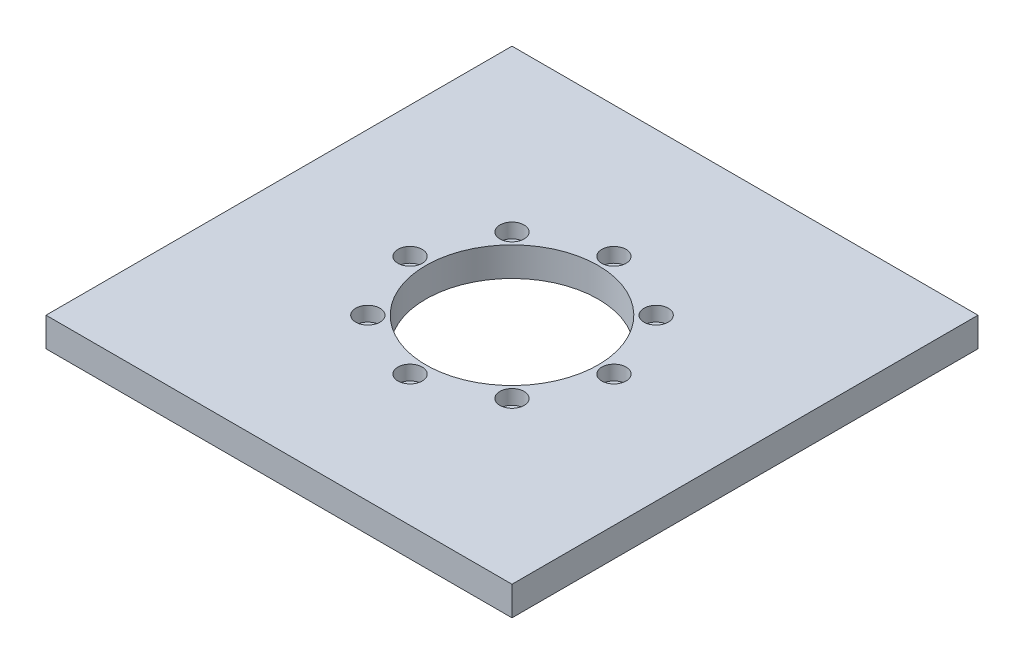
ISO-10303-21;
HEADER;
FILE_DESCRIPTION(('STEP AP214'),'2;1');
FILE_NAME('part.step','',(''),(''),'','','');
FILE_SCHEMA(('AUTOMOTIVE_DESIGN { 1 0 10303 214 1 1 1 1 }'));
ENDSEC;
DATA;
#1=APPLICATION_CONTEXT('core data for automotive mechanical design processes');
#2=APPLICATION_PROTOCOL_DEFINITION('international standard','automotive_design',2000,#1);
#3=PRODUCT_CONTEXT('',#1,'mechanical');
#4=PRODUCT('Part','Part','',(#3));
#5=PRODUCT_RELATED_PRODUCT_CATEGORY('part','',(#4));
#6=PRODUCT_DEFINITION_FORMATION('','',#4);
#7=PRODUCT_DEFINITION_CONTEXT('part definition',#1,'design');
#8=PRODUCT_DEFINITION('design','',#6,#7);
#9=PRODUCT_DEFINITION_SHAPE('','',#8);
#10=(LENGTH_UNIT() NAMED_UNIT(*) SI_UNIT(.MILLI.,.METRE.));
#11=(NAMED_UNIT(*) PLANE_ANGLE_UNIT() SI_UNIT($,.RADIAN.));
#12=(NAMED_UNIT(*) SI_UNIT($,.STERADIAN.) SOLID_ANGLE_UNIT());
#13=UNCERTAINTY_MEASURE_WITH_UNIT(LENGTH_MEASURE(1.E-05),#10,'distance_accuracy_value','');
#14=(GEOMETRIC_REPRESENTATION_CONTEXT(3) GLOBAL_UNCERTAINTY_ASSIGNED_CONTEXT((#13)) GLOBAL_UNIT_ASSIGNED_CONTEXT((#10,
#11,#12)) REPRESENTATION_CONTEXT('',''));
#15=CARTESIAN_POINT('',(0.,0.,0.));
#16=DIRECTION('',(0.,0.,1.));
#17=DIRECTION('',(1.,0.,0.));
#18=AXIS2_PLACEMENT_3D('',#15,#16,#17);
#19=CARTESIAN_POINT('',(0.,19.05,0.));
#20=DIRECTION('',(0.,1.,0.));
#21=DIRECTION('',(0.,0.,1.));
#22=AXIS2_PLACEMENT_3D('',#19,#20,#21);
#23=PLANE('',#22);
#24=CARTESIAN_POINT('',(66.675,19.05,-7.68489198065737E-13));
#25=DIRECTION('',(0.,1.,0.));
#26=DIRECTION('',(0.,0.,1.));
#27=AXIS2_PLACEMENT_3D('',#24,#25,#26);
#28=CIRCLE('',#27,7.9375);
#29=CARTESIAN_POINT('',(66.675,19.05,7.93749999999923));
#30=VERTEX_POINT('',#29);
#31=EDGE_CURVE('E210',#30,#30,#28,.T.);
#32=ORIENTED_EDGE('',*,*,#31,.F.);
#33=EDGE_LOOP('',(#32));
#34=FACE_BOUND('',#33,.T.);
#35=CARTESIAN_POINT('',(47.1463446356131,19.05,-47.1463446356131));
#36=DIRECTION('',(0.,1.,0.));
#37=DIRECTION('',(0.,0.,1.));
#38=AXIS2_PLACEMENT_3D('',#35,#36,#37);
#39=CIRCLE('',#38,7.9375);
#40=CARTESIAN_POINT('',(47.1463446356131,19.05,-39.2088446356131));
#41=VERTEX_POINT('',#40);
#42=EDGE_CURVE('E198',#41,#41,#39,.T.);
#43=ORIENTED_EDGE('',*,*,#42,.F.);
#44=EDGE_LOOP('',(#43));
#45=FACE_BOUND('',#44,.T.);
#46=CARTESIAN_POINT('',(0.,19.05,-66.675));
#47=DIRECTION('',(0.,1.,0.));
#48=DIRECTION('',(0.,0.,1.));
#49=AXIS2_PLACEMENT_3D('',#46,#47,#48);
#50=CIRCLE('',#49,7.9375);
#51=CARTESIAN_POINT('',(0.,19.05,-58.7375));
#52=VERTEX_POINT('',#51);
#53=EDGE_CURVE('E186',#52,#52,#50,.T.);
#54=ORIENTED_EDGE('',*,*,#53,.F.);
#55=EDGE_LOOP('',(#54));
#56=FACE_BOUND('',#55,.T.);
#57=CARTESIAN_POINT('',(-47.146344635613,19.05,-47.1463446356131));
#58=DIRECTION('',(0.,1.,0.));
#59=DIRECTION('',(0.,0.,1.));
#60=AXIS2_PLACEMENT_3D('',#57,#58,#59);
#61=CIRCLE('',#60,7.9375);
#62=CARTESIAN_POINT('',(-47.146344635613,19.05,-39.2088446356131));
#63=VERTEX_POINT('',#62);
#64=EDGE_CURVE('E174',#63,#63,#61,.T.);
#65=ORIENTED_EDGE('',*,*,#64,.F.);
#66=EDGE_LOOP('',(#65));
#67=FACE_BOUND('',#66,.T.);
#68=CARTESIAN_POINT('',(-66.675,19.05,0.));
#69=DIRECTION('',(0.,1.,0.));
#70=DIRECTION('',(0.,0.,1.));
#71=AXIS2_PLACEMENT_3D('',#68,#69,#70);
#72=CIRCLE('',#71,7.9375);
#73=CARTESIAN_POINT('',(-66.675,19.05,7.9375));
#74=VERTEX_POINT('',#73);
#75=EDGE_CURVE('E162',#74,#74,#72,.T.);
#76=ORIENTED_EDGE('',*,*,#75,.F.);
#77=EDGE_LOOP('',(#76));
#78=FACE_BOUND('',#77,.T.);
#79=CARTESIAN_POINT('',(-47.1463446356131,19.05,47.146344635613));
#80=DIRECTION('',(0.,1.,0.));
#81=DIRECTION('',(0.,0.,1.));
#82=AXIS2_PLACEMENT_3D('',#79,#80,#81);
#83=CIRCLE('',#82,7.9375);
#84=CARTESIAN_POINT('',(-47.1463446356131,19.05,55.083844635613));
#85=VERTEX_POINT('',#84);
#86=EDGE_CURVE('E150',#85,#85,#83,.T.);
#87=ORIENTED_EDGE('',*,*,#86,.F.);
#88=EDGE_LOOP('',(#87));
#89=FACE_BOUND('',#88,.T.);
#90=CARTESIAN_POINT('',(0.,19.05,66.675));
#91=DIRECTION('',(0.,1.,0.));
#92=DIRECTION('',(0.,0.,1.));
#93=AXIS2_PLACEMENT_3D('',#90,#91,#92);
#94=CIRCLE('',#93,7.9375);
#95=CARTESIAN_POINT('',(0.,19.05,74.6125));
#96=VERTEX_POINT('',#95);
#97=EDGE_CURVE('E138',#96,#96,#94,.T.);
#98=ORIENTED_EDGE('',*,*,#97,.F.);
#99=EDGE_LOOP('',(#98));
#100=FACE_BOUND('',#99,.T.);
#101=CARTESIAN_POINT('',(47.146344635613,19.05,47.1463446356131));
#102=DIRECTION('',(0.,1.,0.));
#103=DIRECTION('',(0.,0.,1.));
#104=AXIS2_PLACEMENT_3D('',#101,#102,#103);
#105=CIRCLE('',#104,7.9375);
#106=CARTESIAN_POINT('',(47.146344635613,19.05,55.0838446356131));
#107=VERTEX_POINT('',#106);
#108=EDGE_CURVE('E126',#107,#107,#105,.T.);
#109=ORIENTED_EDGE('',*,*,#108,.F.);
#110=EDGE_LOOP('',(#109));
#111=FACE_BOUND('',#110,.T.);
#112=DIRECTION('',(0.,0.,1.));
#113=VECTOR('',#112,1.);
#114=CARTESIAN_POINT('',(-152.4,19.05,152.4));
#115=LINE('',#114,#113);
#116=CARTESIAN_POINT('',(-152.4,19.05,-152.4));
#117=VERTEX_POINT('',#116);
#118=CARTESIAN_POINT('',(-152.4,19.05,152.4));
#119=VERTEX_POINT('',#118);
#120=EDGE_CURVE('E85',#117,#119,#115,.T.);
#121=ORIENTED_EDGE('',*,*,#120,.T.);
#122=DIRECTION('',(1.,0.,0.));
#123=VECTOR('',#122,1.);
#124=CARTESIAN_POINT('',(152.4,19.05,152.4));
#125=LINE('',#124,#123);
#126=CARTESIAN_POINT('',(152.4,19.05,152.4));
#127=VERTEX_POINT('',#126);
#128=EDGE_CURVE('E80',#119,#127,#125,.T.);
#129=ORIENTED_EDGE('',*,*,#128,.T.);
#130=DIRECTION('',(0.,0.,-1.));
#131=VECTOR('',#130,1.);
#132=CARTESIAN_POINT('',(152.4,19.05,152.4));
#133=LINE('',#132,#131);
#134=CARTESIAN_POINT('',(152.4,19.05,-152.4));
#135=VERTEX_POINT('',#134);
#136=EDGE_CURVE('E83',#127,#135,#133,.T.);
#137=ORIENTED_EDGE('',*,*,#136,.T.);
#138=DIRECTION('',(-1.,0.,0.));
#139=VECTOR('',#138,1.);
#140=CARTESIAN_POINT('',(152.4,19.05,-152.4));
#141=LINE('',#140,#139);
#142=EDGE_CURVE('E50',#135,#117,#141,.T.);
#143=ORIENTED_EDGE('',*,*,#142,.T.);
#144=EDGE_LOOP('',(#121,#129,#137,#143));
#145=FACE_BOUND('',#144,.T.);
#146=CARTESIAN_POINT('',(0.,19.05,0.));
#147=DIRECTION('',(0.,1.,0.));
#148=DIRECTION('',(0.,0.,1.));
#149=AXIS2_PLACEMENT_3D('',#146,#147,#148);
#150=CIRCLE('',#149,56.35625);
#151=CARTESIAN_POINT('',(0.,19.05,-56.35625));
#152=VERTEX_POINT('',#151);
#153=EDGE_CURVE('E100',#152,#152,#150,.T.);
#154=ORIENTED_EDGE('',*,*,#153,.F.);
#155=EDGE_LOOP('',(#154));
#156=FACE_BOUND('',#155,.T.);
#157=ADVANCED_FACE('F33',(#34,#45,#56,#67,#78,#89,#100,#111,#145,#156),#23,.T.);
#158=CARTESIAN_POINT('',(0.,0.,0.));
#159=DIRECTION('',(0.,1.,0.));
#160=DIRECTION('',(0.,0.,1.));
#161=AXIS2_PLACEMENT_3D('',#158,#159,#160);
#162=PLANE('',#161);
#163=CARTESIAN_POINT('',(66.675,0.,-7.68489198065737E-13));
#164=DIRECTION('',(0.,1.,0.));
#165=DIRECTION('',(0.,0.,1.));
#166=AXIS2_PLACEMENT_3D('',#163,#164,#165);
#167=CIRCLE('',#166,4.90220000000001);
#168=CARTESIAN_POINT('',(66.675,0.,4.90219999999924));
#169=VERTEX_POINT('',#168);
#170=EDGE_CURVE('E201',#169,#169,#167,.T.);
#171=ORIENTED_EDGE('',*,*,#170,.T.);
#172=EDGE_LOOP('',(#171));
#173=FACE_BOUND('',#172,.T.);
#174=CARTESIAN_POINT('',(47.1463446356131,0.,-47.1463446356131));
#175=DIRECTION('',(0.,1.,0.));
#176=DIRECTION('',(0.,0.,1.));
#177=AXIS2_PLACEMENT_3D('',#174,#175,#176);
#178=CIRCLE('',#177,4.9022);
#179=CARTESIAN_POINT('',(47.1463446356131,0.,-42.2441446356131));
#180=VERTEX_POINT('',#179);
#181=EDGE_CURVE('E189',#180,#180,#178,.T.);
#182=ORIENTED_EDGE('',*,*,#181,.T.);
#183=EDGE_LOOP('',(#182));
#184=FACE_BOUND('',#183,.T.);
#185=CARTESIAN_POINT('',(0.,0.,-66.675));
#186=DIRECTION('',(0.,1.,0.));
#187=DIRECTION('',(0.,0.,1.));
#188=AXIS2_PLACEMENT_3D('',#185,#186,#187);
#189=CIRCLE('',#188,4.90220000000001);
#190=CARTESIAN_POINT('',(0.,0.,-61.7728));
#191=VERTEX_POINT('',#190);
#192=EDGE_CURVE('E177',#191,#191,#189,.T.);
#193=ORIENTED_EDGE('',*,*,#192,.T.);
#194=EDGE_LOOP('',(#193));
#195=FACE_BOUND('',#194,.T.);
#196=CARTESIAN_POINT('',(-47.146344635613,0.,-47.1463446356131));
#197=DIRECTION('',(0.,1.,0.));
#198=DIRECTION('',(0.,0.,1.));
#199=AXIS2_PLACEMENT_3D('',#196,#197,#198);
#200=CIRCLE('',#199,4.9022);
#201=CARTESIAN_POINT('',(-47.146344635613,0.,-42.2441446356131));
#202=VERTEX_POINT('',#201);
#203=EDGE_CURVE('E165',#202,#202,#200,.T.);
#204=ORIENTED_EDGE('',*,*,#203,.T.);
#205=EDGE_LOOP('',(#204));
#206=FACE_BOUND('',#205,.T.);
#207=CARTESIAN_POINT('',(-66.675,0.,0.));
#208=DIRECTION('',(0.,1.,0.));
#209=DIRECTION('',(0.,0.,1.));
#210=AXIS2_PLACEMENT_3D('',#207,#208,#209);
#211=CIRCLE('',#210,4.90220000000001);
#212=CARTESIAN_POINT('',(-66.675,0.,4.90220000000001));
#213=VERTEX_POINT('',#212);
#214=EDGE_CURVE('E153',#213,#213,#211,.T.);
#215=ORIENTED_EDGE('',*,*,#214,.T.);
#216=EDGE_LOOP('',(#215));
#217=FACE_BOUND('',#216,.T.);
#218=CARTESIAN_POINT('',(-47.1463446356131,0.,47.146344635613));
#219=DIRECTION('',(0.,1.,0.));
#220=DIRECTION('',(0.,0.,1.));
#221=AXIS2_PLACEMENT_3D('',#218,#219,#220);
#222=CIRCLE('',#221,4.90220000000001);
#223=CARTESIAN_POINT('',(-47.1463446356131,0.,52.0485446356131));
#224=VERTEX_POINT('',#223);
#225=EDGE_CURVE('E141',#224,#224,#222,.T.);
#226=ORIENTED_EDGE('',*,*,#225,.T.);
#227=EDGE_LOOP('',(#226));
#228=FACE_BOUND('',#227,.T.);
#229=CARTESIAN_POINT('',(0.,0.,66.675));
#230=DIRECTION('',(0.,1.,0.));
#231=DIRECTION('',(0.,0.,1.));
#232=AXIS2_PLACEMENT_3D('',#229,#230,#231);
#233=CIRCLE('',#232,4.90220000000001);
#234=CARTESIAN_POINT('',(0.,0.,71.5772));
#235=VERTEX_POINT('',#234);
#236=EDGE_CURVE('E129',#235,#235,#233,.T.);
#237=ORIENTED_EDGE('',*,*,#236,.T.);
#238=EDGE_LOOP('',(#237));
#239=FACE_BOUND('',#238,.T.);
#240=CARTESIAN_POINT('',(47.146344635613,0.,47.1463446356131));
#241=DIRECTION('',(0.,1.,0.));
#242=DIRECTION('',(0.,0.,1.));
#243=AXIS2_PLACEMENT_3D('',#240,#241,#242);
#244=CIRCLE('',#243,4.9022);
#245=CARTESIAN_POINT('',(47.146344635613,0.,52.0485446356131));
#246=VERTEX_POINT('',#245);
#247=EDGE_CURVE('E115',#246,#246,#244,.T.);
#248=ORIENTED_EDGE('',*,*,#247,.T.);
#249=EDGE_LOOP('',(#248));
#250=FACE_BOUND('',#249,.T.);
#251=DIRECTION('',(0.,0.,1.));
#252=VECTOR('',#251,1.);
#253=CARTESIAN_POINT('',(-152.4,0.,152.4));
#254=LINE('',#253,#252);
#255=CARTESIAN_POINT('',(-152.4,0.,-152.4));
#256=VERTEX_POINT('',#255);
#257=CARTESIAN_POINT('',(-152.4,0.,152.4));
#258=VERTEX_POINT('',#257);
#259=EDGE_CURVE('E97',#256,#258,#254,.T.);
#260=ORIENTED_EDGE('',*,*,#259,.F.);
#261=DIRECTION('',(-1.,0.,0.));
#262=VECTOR('',#261,1.);
#263=CARTESIAN_POINT('',(152.4,0.,-152.4));
#264=LINE('',#263,#262);
#265=CARTESIAN_POINT('',(152.4,0.,-152.4));
#266=VERTEX_POINT('',#265);
#267=EDGE_CURVE('E73',#266,#256,#264,.T.);
#268=ORIENTED_EDGE('',*,*,#267,.F.);
#269=DIRECTION('',(0.,0.,-1.));
#270=VECTOR('',#269,1.);
#271=CARTESIAN_POINT('',(152.4,0.,152.4));
#272=LINE('',#271,#270);
#273=CARTESIAN_POINT('',(152.4,0.,152.4));
#274=VERTEX_POINT('',#273);
#275=EDGE_CURVE('E67',#274,#266,#272,.T.);
#276=ORIENTED_EDGE('',*,*,#275,.F.);
#277=DIRECTION('',(1.,0.,0.));
#278=VECTOR('',#277,1.);
#279=CARTESIAN_POINT('',(152.4,0.,152.4));
#280=LINE('',#279,#278);
#281=EDGE_CURVE('E89',#258,#274,#280,.T.);
#282=ORIENTED_EDGE('',*,*,#281,.F.);
#283=EDGE_LOOP('',(#260,#268,#276,#282));
#284=FACE_BOUND('',#283,.T.);
#285=CARTESIAN_POINT('',(0.,0.,0.));
#286=DIRECTION('',(0.,1.,0.));
#287=DIRECTION('',(0.,0.,1.));
#288=AXIS2_PLACEMENT_3D('',#285,#286,#287);
#289=CIRCLE('',#288,56.35625);
#290=CARTESIAN_POINT('',(0.,0.,-56.35625));
#291=VERTEX_POINT('',#290);
#292=EDGE_CURVE('E112',#291,#291,#289,.T.);
#293=ORIENTED_EDGE('',*,*,#292,.T.);
#294=EDGE_LOOP('',(#293));
#295=FACE_BOUND('',#294,.T.);
#296=ADVANCED_FACE('F108',(#173,#184,#195,#206,#217,#228,#239,#250,#284,#295),#162,.F.);
#297=CARTESIAN_POINT('',(-152.4,19.05,152.4));
#298=DIRECTION('',(1.,0.,0.));
#299=DIRECTION('',(0.,0.,-1.));
#300=AXIS2_PLACEMENT_3D('',#297,#298,#299);
#301=PLANE('',#300);
#302=ORIENTED_EDGE('',*,*,#259,.T.);
#303=DIRECTION('',(0.,-1.,0.));
#304=VECTOR('',#303,1.);
#305=CARTESIAN_POINT('',(-152.4,19.05,152.4));
#306=LINE('',#305,#304);
#307=EDGE_CURVE('E11',#119,#258,#306,.T.);
#308=ORIENTED_EDGE('',*,*,#307,.F.);
#309=ORIENTED_EDGE('',*,*,#120,.F.);
#310=DIRECTION('',(0.,-1.,0.));
#311=VECTOR('',#310,1.);
#312=CARTESIAN_POINT('',(-152.4,19.05,-152.4));
#313=LINE('',#312,#311);
#314=EDGE_CURVE('E93',#117,#256,#313,.T.);
#315=ORIENTED_EDGE('',*,*,#314,.T.);
#316=EDGE_LOOP('',(#302,#308,#309,#315));
#317=FACE_BOUND('',#316,.T.);
#318=ADVANCED_FACE('F35',(#317),#301,.F.);
#319=CARTESIAN_POINT('',(152.4,19.05,152.4));
#320=DIRECTION('',(0.,0.,-1.));
#321=DIRECTION('',(-1.,0.,0.));
#322=AXIS2_PLACEMENT_3D('',#319,#320,#321);
#323=PLANE('',#322);
#324=ORIENTED_EDGE('',*,*,#281,.T.);
#325=DIRECTION('',(0.,-1.,0.));
#326=VECTOR('',#325,1.);
#327=CARTESIAN_POINT('',(152.4,19.05,152.4));
#328=LINE('',#327,#326);
#329=EDGE_CURVE('E42',#127,#274,#328,.T.);
#330=ORIENTED_EDGE('',*,*,#329,.F.);
#331=ORIENTED_EDGE('',*,*,#128,.F.);
#332=ORIENTED_EDGE('',*,*,#307,.T.);
#333=EDGE_LOOP('',(#324,#330,#331,#332));
#334=FACE_BOUND('',#333,.T.);
#335=ADVANCED_FACE('F88',(#334),#323,.F.);
#336=CARTESIAN_POINT('',(152.4,19.05,152.4));
#337=DIRECTION('',(-1.,0.,0.));
#338=DIRECTION('',(0.,0.,1.));
#339=AXIS2_PLACEMENT_3D('',#336,#337,#338);
#340=PLANE('',#339);
#341=ORIENTED_EDGE('',*,*,#275,.T.);
#342=DIRECTION('',(0.,-1.,0.));
#343=VECTOR('',#342,1.);
#344=CARTESIAN_POINT('',(152.4,19.05,-152.4));
#345=LINE('',#344,#343);
#346=EDGE_CURVE('E90',#135,#266,#345,.T.);
#347=ORIENTED_EDGE('',*,*,#346,.F.);
#348=ORIENTED_EDGE('',*,*,#136,.F.);
#349=ORIENTED_EDGE('',*,*,#329,.T.);
#350=EDGE_LOOP('',(#341,#347,#348,#349));
#351=FACE_BOUND('',#350,.T.);
#352=ADVANCED_FACE('F91',(#351),#340,.F.);
#353=CARTESIAN_POINT('',(152.4,19.05,-152.4));
#354=DIRECTION('',(0.,0.,1.));
#355=DIRECTION('',(1.,0.,0.));
#356=AXIS2_PLACEMENT_3D('',#353,#354,#355);
#357=PLANE('',#356);
#358=ORIENTED_EDGE('',*,*,#267,.T.);
#359=ORIENTED_EDGE('',*,*,#314,.F.);
#360=ORIENTED_EDGE('',*,*,#142,.F.);
#361=ORIENTED_EDGE('',*,*,#346,.T.);
#362=EDGE_LOOP('',(#358,#359,#360,#361));
#363=FACE_BOUND('',#362,.T.);
#364=ADVANCED_FACE('F105',(#363),#357,.F.);
#365=CARTESIAN_POINT('',(0.,19.05,0.));
#366=DIRECTION('',(0.,-1.,0.));
#367=DIRECTION('',(0.,0.,-1.));
#368=AXIS2_PLACEMENT_3D('',#365,#366,#367);
#369=CYLINDRICAL_SURFACE('',#368,56.35625);
#370=CARTESIAN_POINT('',(0.,19.05,-56.35625));
#371=CARTESIAN_POINT('',(0.,18.8515625,-56.35625));
#372=CARTESIAN_POINT('',(0.,18.653125,-56.35625));
#373=CARTESIAN_POINT('',(0.,18.25625,-56.35625));
#374=CARTESIAN_POINT('',(0.,18.0578125,-56.35625));
#375=CARTESIAN_POINT('',(0.,17.6609375,-56.35625));
#376=CARTESIAN_POINT('',(0.,17.4625,-56.35625));
#377=CARTESIAN_POINT('',(0.,17.065625,-56.35625));
#378=CARTESIAN_POINT('',(0.,16.8671875,-56.35625));
#379=CARTESIAN_POINT('',(0.,16.4703125,-56.35625));
#380=CARTESIAN_POINT('',(0.,16.271875,-56.35625));
#381=CARTESIAN_POINT('',(0.,15.875,-56.35625));
#382=CARTESIAN_POINT('',(0.,15.6765625,-56.35625));
#383=CARTESIAN_POINT('',(0.,15.2796875,-56.35625));
#384=CARTESIAN_POINT('',(0.,15.08125,-56.35625));
#385=CARTESIAN_POINT('',(0.,14.684375,-56.35625));
#386=CARTESIAN_POINT('',(0.,14.4859375,-56.35625));
#387=CARTESIAN_POINT('',(0.,14.0890625,-56.35625));
#388=CARTESIAN_POINT('',(0.,13.890625,-56.35625));
#389=CARTESIAN_POINT('',(0.,13.49375,-56.35625));
#390=CARTESIAN_POINT('',(0.,13.2953125,-56.35625));
#391=CARTESIAN_POINT('',(0.,12.8984375,-56.35625));
#392=CARTESIAN_POINT('',(0.,12.7,-56.35625));
#393=CARTESIAN_POINT('',(0.,12.303125,-56.35625));
#394=CARTESIAN_POINT('',(0.,12.1046875,-56.35625));
#395=CARTESIAN_POINT('',(0.,11.7078125,-56.35625));
#396=CARTESIAN_POINT('',(0.,11.509375,-56.35625));
#397=CARTESIAN_POINT('',(0.,11.1125,-56.35625));
#398=CARTESIAN_POINT('',(0.,10.9140625,-56.35625));
#399=CARTESIAN_POINT('',(0.,10.5171875,-56.35625));
#400=CARTESIAN_POINT('',(0.,10.31875,-56.35625));
#401=CARTESIAN_POINT('',(0.,9.921875,-56.35625));
#402=CARTESIAN_POINT('',(0.,9.7234375,-56.35625));
#403=CARTESIAN_POINT('',(0.,9.3265625,-56.35625));
#404=CARTESIAN_POINT('',(0.,9.128125,-56.35625));
#405=CARTESIAN_POINT('',(0.,8.73125,-56.35625));
#406=CARTESIAN_POINT('',(0.,8.5328125,-56.35625));
#407=CARTESIAN_POINT('',(0.,8.1359375,-56.35625));
#408=CARTESIAN_POINT('',(0.,7.9375,-56.35625));
#409=CARTESIAN_POINT('',(0.,7.540625,-56.35625));
#410=CARTESIAN_POINT('',(0.,7.3421875,-56.35625));
#411=CARTESIAN_POINT('',(0.,6.9453125,-56.35625));
#412=CARTESIAN_POINT('',(0.,6.746875,-56.35625));
#413=CARTESIAN_POINT('',(0.,6.35,-56.35625));
#414=CARTESIAN_POINT('',(0.,6.1515625,-56.35625));
#415=CARTESIAN_POINT('',(0.,5.7546875,-56.35625));
#416=CARTESIAN_POINT('',(0.,5.55625,-56.35625));
#417=CARTESIAN_POINT('',(0.,5.159375,-56.35625));
#418=CARTESIAN_POINT('',(0.,4.9609375,-56.35625));
#419=CARTESIAN_POINT('',(0.,4.5640625,-56.35625));
#420=CARTESIAN_POINT('',(0.,4.365625,-56.35625));
#421=CARTESIAN_POINT('',(0.,3.96875,-56.35625));
#422=CARTESIAN_POINT('',(0.,3.7703125,-56.35625));
#423=CARTESIAN_POINT('',(0.,3.3734375,-56.35625));
#424=CARTESIAN_POINT('',(0.,3.175,-56.35625));
#425=CARTESIAN_POINT('',(0.,2.778125,-56.35625));
#426=CARTESIAN_POINT('',(0.,2.5796875,-56.35625));
#427=CARTESIAN_POINT('',(0.,2.1828125,-56.35625));
#428=CARTESIAN_POINT('',(0.,1.984375,-56.35625));
#429=CARTESIAN_POINT('',(0.,1.5875,-56.35625));
#430=CARTESIAN_POINT('',(0.,1.3890625,-56.35625));
#431=CARTESIAN_POINT('',(0.,0.992187500000001,-56.35625));
#432=CARTESIAN_POINT('',(0.,0.793750000000001,-56.35625));
#433=CARTESIAN_POINT('',(0.,0.396875,-56.35625));
#434=CARTESIAN_POINT('',(0.,0.1984375,-56.35625));
#435=CARTESIAN_POINT('',(0.,0.,-56.35625));
#436=B_SPLINE_CURVE_WITH_KNOTS('',3,(#370,#371,#372,#373,#374,#375,#376,#377,#378,#379,#380,
#381,#382,#383,#384,#385,#386,#387,#388,#389,#390,#391,#392,#393,#394,#395,#396,#397,#398,#399,
#400,#401,#402,#403,#404,#405,#406,#407,#408,#409,#410,#411,#412,#413,#414,#415,#416,#417,#418,
#419,#420,#421,#422,#423,#424,#425,#426,#427,#428,#429,#430,#431,#432,#433,#434,#435),
.UNSPECIFIED.,.F.,.F.,(4,2,2,2,2,2,2,2,2,2,2,2,2,2,2,2,2,2,2,2,2,2,2,2,2,2,2,2,2,2,2,2,4),(0.,
0.5953125,1.190625,1.7859375,2.38125,2.9765625,3.571875,4.1671875,4.7625,5.3578125,5.953125,
6.5484375,7.14375,7.7390625,8.334375,8.9296875,9.525,10.1203125,10.715625,11.3109375,11.90625,
12.5015625,13.096875,13.6921875,14.2875,14.8828125,15.478125,16.0734375,16.66875,17.2640625,
17.859375,18.4546875,19.05),.UNSPECIFIED.);
#437=EDGE_CURVE('BSEAM254',#152,#291,#436,.T.);
#438=ORIENTED_EDGE('',*,*,#153,.T.);
#439=ORIENTED_EDGE('',*,*,#292,.F.);
#440=ORIENTED_EDGE('',*,*,#437,.T.);
#441=ORIENTED_EDGE('',*,*,#437,.F.);
#442=EDGE_LOOP('',(#438,#440,#439,#441));
#443=FACE_BOUND('',#442,.T.);
#444=ADVANCED_FACE('F254',(#443),#369,.F.);
#445=CARTESIAN_POINT('',(47.146344635613,19.05,47.1463446356131));
#446=DIRECTION('',(0.,1.,0.));
#447=DIRECTION('',(0.,0.,1.));
#448=AXIS2_PLACEMENT_3D('',#445,#446,#447);
#449=CYLINDRICAL_SURFACE('',#448,4.9022);
#450=ORIENTED_EDGE('',*,*,#247,.F.);
#451=EDGE_LOOP('',(#450));
#452=FACE_BOUND('',#451,.T.);
#453=CARTESIAN_POINT('',(47.146344635613,9.525,47.1463446356131));
#454=DIRECTION('',(0.,1.,0.));
#455=DIRECTION('',(0.,0.,1.));
#456=AXIS2_PLACEMENT_3D('',#453,#454,#455);
#457=CIRCLE('',#456,4.9022);
#458=CARTESIAN_POINT('',(47.146344635613,9.525,52.0485446356131));
#459=VERTEX_POINT('',#458);
#460=EDGE_CURVE('E120',#459,#459,#457,.T.);
#461=ORIENTED_EDGE('',*,*,#460,.T.);
#462=EDGE_LOOP('',(#461));
#463=FACE_BOUND('',#462,.T.);
#464=ADVANCED_FACE('F246',(#452,#463),#449,.F.);
#465=CARTESIAN_POINT('',(52.048544635613,9.525,47.1463446356131));
#466=DIRECTION('',(0.,-1.,0.));
#467=DIRECTION('',(0.,0.,-1.));
#468=AXIS2_PLACEMENT_3D('',#465,#466,#467);
#469=PLANE('',#468);
#470=ORIENTED_EDGE('',*,*,#460,.F.);
#471=EDGE_LOOP('',(#470));
#472=FACE_BOUND('',#471,.T.);
#473=CARTESIAN_POINT('',(47.146344635613,9.525,47.1463446356131));
#474=DIRECTION('',(0.,1.,0.));
#475=DIRECTION('',(0.,0.,1.));
#476=AXIS2_PLACEMENT_3D('',#473,#474,#475);
#477=CIRCLE('',#476,7.9375);
#478=CARTESIAN_POINT('',(47.146344635613,9.525,55.0838446356131));
#479=VERTEX_POINT('',#478);
#480=EDGE_CURVE('E123',#479,#479,#477,.T.);
#481=ORIENTED_EDGE('',*,*,#480,.T.);
#482=EDGE_LOOP('',(#481));
#483=FACE_BOUND('',#482,.T.);
#484=ADVANCED_FACE('F236',(#472,#483),#469,.F.);
#485=CARTESIAN_POINT('',(47.146344635613,19.05,47.1463446356131));
#486=DIRECTION('',(0.,1.,0.));
#487=DIRECTION('',(0.,0.,1.));
#488=AXIS2_PLACEMENT_3D('',#485,#486,#487);
#489=CYLINDRICAL_SURFACE('',#488,7.9375);
#490=ORIENTED_EDGE('',*,*,#480,.F.);
#491=EDGE_LOOP('',(#490));
#492=FACE_BOUND('',#491,.T.);
#493=ORIENTED_EDGE('',*,*,#108,.T.);
#494=EDGE_LOOP('',(#493));
#495=FACE_BOUND('',#494,.T.);
#496=ADVANCED_FACE('F233',(#492,#495),#489,.F.);
#497=CARTESIAN_POINT('',(0.,19.05,66.675));
#498=DIRECTION('',(0.,1.,0.));
#499=DIRECTION('',(0.,0.,1.));
#500=AXIS2_PLACEMENT_3D('',#497,#498,#499);
#501=CYLINDRICAL_SURFACE('',#500,4.9022);
#502=ORIENTED_EDGE('',*,*,#236,.F.);
#503=EDGE_LOOP('',(#502));
#504=FACE_BOUND('',#503,.T.);
#505=CARTESIAN_POINT('',(0.,9.525,66.675));
#506=DIRECTION('',(0.,1.,0.));
#507=DIRECTION('',(0.,0.,1.));
#508=AXIS2_PLACEMENT_3D('',#505,#506,#507);
#509=CIRCLE('',#508,4.9022);
#510=CARTESIAN_POINT('',(0.,9.525,71.5772));
#511=VERTEX_POINT('',#510);
#512=EDGE_CURVE('E132',#511,#511,#509,.T.);
#513=ORIENTED_EDGE('',*,*,#512,.T.);
#514=EDGE_LOOP('',(#513));
#515=FACE_BOUND('',#514,.T.);
#516=ADVANCED_FACE('F235',(#504,#515),#501,.F.);
#517=CARTESIAN_POINT('',(4.90220000000003,9.525,66.675));
#518=DIRECTION('',(0.,-1.,0.));
#519=DIRECTION('',(0.,0.,-1.));
#520=AXIS2_PLACEMENT_3D('',#517,#518,#519);
#521=PLANE('',#520);
#522=ORIENTED_EDGE('',*,*,#512,.F.);
#523=EDGE_LOOP('',(#522));
#524=FACE_BOUND('',#523,.T.);
#525=CARTESIAN_POINT('',(0.,9.525,66.675));
#526=DIRECTION('',(0.,1.,0.));
#527=DIRECTION('',(0.,0.,1.));
#528=AXIS2_PLACEMENT_3D('',#525,#526,#527);
#529=CIRCLE('',#528,7.9375);
#530=CARTESIAN_POINT('',(0.,9.525,74.6125));
#531=VERTEX_POINT('',#530);
#532=EDGE_CURVE('E135',#531,#531,#529,.T.);
#533=ORIENTED_EDGE('',*,*,#532,.T.);
#534=EDGE_LOOP('',(#533));
#535=FACE_BOUND('',#534,.T.);
#536=ADVANCED_FACE('F243',(#524,#535),#521,.F.);
#537=CARTESIAN_POINT('',(0.,19.05,66.675));
#538=DIRECTION('',(0.,1.,0.));
#539=DIRECTION('',(0.,0.,1.));
#540=AXIS2_PLACEMENT_3D('',#537,#538,#539);
#541=CYLINDRICAL_SURFACE('',#540,7.9375);
#542=ORIENTED_EDGE('',*,*,#532,.F.);
#543=EDGE_LOOP('',(#542));
#544=FACE_BOUND('',#543,.T.);
#545=ORIENTED_EDGE('',*,*,#97,.T.);
#546=EDGE_LOOP('',(#545));
#547=FACE_BOUND('',#546,.T.);
#548=ADVANCED_FACE('F334',(#544,#547),#541,.F.);
#549=CARTESIAN_POINT('',(-47.1463446356131,19.05,47.146344635613));
#550=DIRECTION('',(0.,1.,0.));
#551=DIRECTION('',(0.,0.,1.));
#552=AXIS2_PLACEMENT_3D('',#549,#550,#551);
#553=CYLINDRICAL_SURFACE('',#552,4.9022);
#554=ORIENTED_EDGE('',*,*,#225,.F.);
#555=EDGE_LOOP('',(#554));
#556=FACE_BOUND('',#555,.T.);
#557=CARTESIAN_POINT('',(-47.1463446356131,9.525,47.146344635613));
#558=DIRECTION('',(0.,1.,0.));
#559=DIRECTION('',(0.,0.,1.));
#560=AXIS2_PLACEMENT_3D('',#557,#558,#559);
#561=CIRCLE('',#560,4.9022);
#562=CARTESIAN_POINT('',(-47.1463446356131,9.525,52.048544635613));
#563=VERTEX_POINT('',#562);
#564=EDGE_CURVE('E144',#563,#563,#561,.T.);
#565=ORIENTED_EDGE('',*,*,#564,.T.);
#566=EDGE_LOOP('',(#565));
#567=FACE_BOUND('',#566,.T.);
#568=ADVANCED_FACE('F343',(#556,#567),#553,.F.);
#569=CARTESIAN_POINT('',(-42.2441446356131,9.525,47.146344635613));
#570=DIRECTION('',(0.,-1.,0.));
#571=DIRECTION('',(0.,0.,-1.));
#572=AXIS2_PLACEMENT_3D('',#569,#570,#571);
#573=PLANE('',#572);
#574=ORIENTED_EDGE('',*,*,#564,.F.);
#575=EDGE_LOOP('',(#574));
#576=FACE_BOUND('',#575,.T.);
#577=CARTESIAN_POINT('',(-47.1463446356131,9.525,47.146344635613));
#578=DIRECTION('',(0.,1.,0.));
#579=DIRECTION('',(0.,0.,1.));
#580=AXIS2_PLACEMENT_3D('',#577,#578,#579);
#581=CIRCLE('',#580,7.9375);
#582=CARTESIAN_POINT('',(-47.1463446356131,9.525,55.083844635613));
#583=VERTEX_POINT('',#582);
#584=EDGE_CURVE('E147',#583,#583,#581,.T.);
#585=ORIENTED_EDGE('',*,*,#584,.T.);
#586=EDGE_LOOP('',(#585));
#587=FACE_BOUND('',#586,.T.);
#588=ADVANCED_FACE('F353',(#576,#587),#573,.F.);
#589=CARTESIAN_POINT('',(-47.1463446356131,19.05,47.146344635613));
#590=DIRECTION('',(0.,1.,0.));
#591=DIRECTION('',(0.,0.,1.));
#592=AXIS2_PLACEMENT_3D('',#589,#590,#591);
#593=CYLINDRICAL_SURFACE('',#592,7.9375);
#594=ORIENTED_EDGE('',*,*,#584,.F.);
#595=EDGE_LOOP('',(#594));
#596=FACE_BOUND('',#595,.T.);
#597=ORIENTED_EDGE('',*,*,#86,.T.);
#598=EDGE_LOOP('',(#597));
#599=FACE_BOUND('',#598,.T.);
#600=ADVANCED_FACE('F363',(#596,#599),#593,.F.);
#601=CARTESIAN_POINT('',(-66.675,19.05,0.));
#602=DIRECTION('',(0.,1.,0.));
#603=DIRECTION('',(0.,0.,1.));
#604=AXIS2_PLACEMENT_3D('',#601,#602,#603);
#605=CYLINDRICAL_SURFACE('',#604,4.9022);
#606=ORIENTED_EDGE('',*,*,#214,.F.);
#607=EDGE_LOOP('',(#606));
#608=FACE_BOUND('',#607,.T.);
#609=CARTESIAN_POINT('',(-66.675,9.525,0.));
#610=DIRECTION('',(0.,1.,0.));
#611=DIRECTION('',(0.,0.,1.));
#612=AXIS2_PLACEMENT_3D('',#609,#610,#611);
#613=CIRCLE('',#612,4.9022);
#614=CARTESIAN_POINT('',(-66.675,9.525,4.9022));
#615=VERTEX_POINT('',#614);
#616=EDGE_CURVE('E156',#615,#615,#613,.T.);
#617=ORIENTED_EDGE('',*,*,#616,.T.);
#618=EDGE_LOOP('',(#617));
#619=FACE_BOUND('',#618,.T.);
#620=ADVANCED_FACE('F373',(#608,#619),#605,.F.);
#621=CARTESIAN_POINT('',(-61.7728,9.525,0.));
#622=DIRECTION('',(0.,-1.,0.));
#623=DIRECTION('',(0.,0.,-1.));
#624=AXIS2_PLACEMENT_3D('',#621,#622,#623);
#625=PLANE('',#624);
#626=ORIENTED_EDGE('',*,*,#616,.F.);
#627=EDGE_LOOP('',(#626));
#628=FACE_BOUND('',#627,.T.);
#629=CARTESIAN_POINT('',(-66.675,9.525,0.));
#630=DIRECTION('',(0.,1.,0.));
#631=DIRECTION('',(0.,0.,1.));
#632=AXIS2_PLACEMENT_3D('',#629,#630,#631);
#633=CIRCLE('',#632,7.9375);
#634=CARTESIAN_POINT('',(-66.675,9.525,7.9375));
#635=VERTEX_POINT('',#634);
#636=EDGE_CURVE('E159',#635,#635,#633,.T.);
#637=ORIENTED_EDGE('',*,*,#636,.T.);
#638=EDGE_LOOP('',(#637));
#639=FACE_BOUND('',#638,.T.);
#640=ADVANCED_FACE('F383',(#628,#639),#625,.F.);
#641=CARTESIAN_POINT('',(-66.675,19.05,0.));
#642=DIRECTION('',(0.,1.,0.));
#643=DIRECTION('',(0.,0.,1.));
#644=AXIS2_PLACEMENT_3D('',#641,#642,#643);
#645=CYLINDRICAL_SURFACE('',#644,7.9375);
#646=ORIENTED_EDGE('',*,*,#636,.F.);
#647=EDGE_LOOP('',(#646));
#648=FACE_BOUND('',#647,.T.);
#649=ORIENTED_EDGE('',*,*,#75,.T.);
#650=EDGE_LOOP('',(#649));
#651=FACE_BOUND('',#650,.T.);
#652=ADVANCED_FACE('F393',(#648,#651),#645,.F.);
#653=CARTESIAN_POINT('',(-47.146344635613,19.05,-47.1463446356131));
#654=DIRECTION('',(0.,1.,0.));
#655=DIRECTION('',(0.,0.,1.));
#656=AXIS2_PLACEMENT_3D('',#653,#654,#655);
#657=CYLINDRICAL_SURFACE('',#656,4.9022);
#658=ORIENTED_EDGE('',*,*,#203,.F.);
#659=EDGE_LOOP('',(#658));
#660=FACE_BOUND('',#659,.T.);
#661=CARTESIAN_POINT('',(-47.146344635613,9.525,-47.1463446356131));
#662=DIRECTION('',(0.,1.,0.));
#663=DIRECTION('',(0.,0.,1.));
#664=AXIS2_PLACEMENT_3D('',#661,#662,#663);
#665=CIRCLE('',#664,4.9022);
#666=CARTESIAN_POINT('',(-47.146344635613,9.525,-42.2441446356131));
#667=VERTEX_POINT('',#666);
#668=EDGE_CURVE('E168',#667,#667,#665,.T.);
#669=ORIENTED_EDGE('',*,*,#668,.T.);
#670=EDGE_LOOP('',(#669));
#671=FACE_BOUND('',#670,.T.);
#672=ADVANCED_FACE('F403',(#660,#671),#657,.F.);
#673=CARTESIAN_POINT('',(-42.244144635613,9.525,-47.1463446356131));
#674=DIRECTION('',(0.,-1.,0.));
#675=DIRECTION('',(0.,0.,-1.));
#676=AXIS2_PLACEMENT_3D('',#673,#674,#675);
#677=PLANE('',#676);
#678=ORIENTED_EDGE('',*,*,#668,.F.);
#679=EDGE_LOOP('',(#678));
#680=FACE_BOUND('',#679,.T.);
#681=CARTESIAN_POINT('',(-47.146344635613,9.525,-47.1463446356131));
#682=DIRECTION('',(0.,1.,0.));
#683=DIRECTION('',(0.,0.,1.));
#684=AXIS2_PLACEMENT_3D('',#681,#682,#683);
#685=CIRCLE('',#684,7.9375);
#686=CARTESIAN_POINT('',(-47.146344635613,9.525,-39.2088446356131));
#687=VERTEX_POINT('',#686);
#688=EDGE_CURVE('E171',#687,#687,#685,.T.);
#689=ORIENTED_EDGE('',*,*,#688,.T.);
#690=EDGE_LOOP('',(#689));
#691=FACE_BOUND('',#690,.T.);
#692=ADVANCED_FACE('F413',(#680,#691),#677,.F.);
#693=CARTESIAN_POINT('',(-47.146344635613,19.05,-47.1463446356131));
#694=DIRECTION('',(0.,1.,0.));
#695=DIRECTION('',(0.,0.,1.));
#696=AXIS2_PLACEMENT_3D('',#693,#694,#695);
#697=CYLINDRICAL_SURFACE('',#696,7.9375);
#698=ORIENTED_EDGE('',*,*,#688,.F.);
#699=EDGE_LOOP('',(#698));
#700=FACE_BOUND('',#699,.T.);
#701=ORIENTED_EDGE('',*,*,#64,.T.);
#702=EDGE_LOOP('',(#701));
#703=FACE_BOUND('',#702,.T.);
#704=ADVANCED_FACE('F423',(#700,#703),#697,.F.);
#705=CARTESIAN_POINT('',(0.,19.05,-66.675));
#706=DIRECTION('',(0.,1.,0.));
#707=DIRECTION('',(0.,0.,1.));
#708=AXIS2_PLACEMENT_3D('',#705,#706,#707);
#709=CYLINDRICAL_SURFACE('',#708,4.9022);
#710=ORIENTED_EDGE('',*,*,#192,.F.);
#711=EDGE_LOOP('',(#710));
#712=FACE_BOUND('',#711,.T.);
#713=CARTESIAN_POINT('',(0.,9.525,-66.675));
#714=DIRECTION('',(0.,1.,0.));
#715=DIRECTION('',(0.,0.,1.));
#716=AXIS2_PLACEMENT_3D('',#713,#714,#715);
#717=CIRCLE('',#716,4.9022);
#718=CARTESIAN_POINT('',(0.,9.525,-61.7728));
#719=VERTEX_POINT('',#718);
#720=EDGE_CURVE('E180',#719,#719,#717,.T.);
#721=ORIENTED_EDGE('',*,*,#720,.T.);
#722=EDGE_LOOP('',(#721));
#723=FACE_BOUND('',#722,.T.);
#724=ADVANCED_FACE('F433',(#712,#723),#709,.F.);
#725=CARTESIAN_POINT('',(4.90220000000001,9.525,-66.675));
#726=DIRECTION('',(0.,-1.,0.));
#727=DIRECTION('',(0.,0.,-1.));
#728=AXIS2_PLACEMENT_3D('',#725,#726,#727);
#729=PLANE('',#728);
#730=ORIENTED_EDGE('',*,*,#720,.F.);
#731=EDGE_LOOP('',(#730));
#732=FACE_BOUND('',#731,.T.);
#733=CARTESIAN_POINT('',(0.,9.525,-66.675));
#734=DIRECTION('',(0.,1.,0.));
#735=DIRECTION('',(0.,0.,1.));
#736=AXIS2_PLACEMENT_3D('',#733,#734,#735);
#737=CIRCLE('',#736,7.9375);
#738=CARTESIAN_POINT('',(0.,9.525,-58.7375));
#739=VERTEX_POINT('',#738);
#740=EDGE_CURVE('E183',#739,#739,#737,.T.);
#741=ORIENTED_EDGE('',*,*,#740,.T.);
#742=EDGE_LOOP('',(#741));
#743=FACE_BOUND('',#742,.T.);
#744=ADVANCED_FACE('F443',(#732,#743),#729,.F.);
#745=CARTESIAN_POINT('',(0.,19.05,-66.675));
#746=DIRECTION('',(0.,1.,0.));
#747=DIRECTION('',(0.,0.,1.));
#748=AXIS2_PLACEMENT_3D('',#745,#746,#747);
#749=CYLINDRICAL_SURFACE('',#748,7.9375);
#750=ORIENTED_EDGE('',*,*,#740,.F.);
#751=EDGE_LOOP('',(#750));
#752=FACE_BOUND('',#751,.T.);
#753=ORIENTED_EDGE('',*,*,#53,.T.);
#754=EDGE_LOOP('',(#753));
#755=FACE_BOUND('',#754,.T.);
#756=ADVANCED_FACE('F453',(#752,#755),#749,.F.);
#757=CARTESIAN_POINT('',(47.1463446356131,19.05,-47.1463446356131));
#758=DIRECTION('',(0.,1.,0.));
#759=DIRECTION('',(0.,0.,1.));
#760=AXIS2_PLACEMENT_3D('',#757,#758,#759);
#761=CYLINDRICAL_SURFACE('',#760,4.9022);
#762=ORIENTED_EDGE('',*,*,#181,.F.);
#763=EDGE_LOOP('',(#762));
#764=FACE_BOUND('',#763,.T.);
#765=CARTESIAN_POINT('',(47.1463446356131,9.525,-47.1463446356131));
#766=DIRECTION('',(0.,1.,0.));
#767=DIRECTION('',(0.,0.,1.));
#768=AXIS2_PLACEMENT_3D('',#765,#766,#767);
#769=CIRCLE('',#768,4.9022);
#770=CARTESIAN_POINT('',(47.1463446356131,9.525,-42.2441446356131));
#771=VERTEX_POINT('',#770);
#772=EDGE_CURVE('E192',#771,#771,#769,.T.);
#773=ORIENTED_EDGE('',*,*,#772,.T.);
#774=EDGE_LOOP('',(#773));
#775=FACE_BOUND('',#774,.T.);
#776=ADVANCED_FACE('F463',(#764,#775),#761,.F.);
#777=CARTESIAN_POINT('',(52.0485446356131,9.525,-47.1463446356131));
#778=DIRECTION('',(0.,-1.,0.));
#779=DIRECTION('',(0.,0.,-1.));
#780=AXIS2_PLACEMENT_3D('',#777,#778,#779);
#781=PLANE('',#780);
#782=ORIENTED_EDGE('',*,*,#772,.F.);
#783=EDGE_LOOP('',(#782));
#784=FACE_BOUND('',#783,.T.);
#785=CARTESIAN_POINT('',(47.1463446356131,9.525,-47.1463446356131));
#786=DIRECTION('',(0.,1.,0.));
#787=DIRECTION('',(0.,0.,1.));
#788=AXIS2_PLACEMENT_3D('',#785,#786,#787);
#789=CIRCLE('',#788,7.9375);
#790=CARTESIAN_POINT('',(47.1463446356131,9.525,-39.2088446356131));
#791=VERTEX_POINT('',#790);
#792=EDGE_CURVE('E195',#791,#791,#789,.T.);
#793=ORIENTED_EDGE('',*,*,#792,.T.);
#794=EDGE_LOOP('',(#793));
#795=FACE_BOUND('',#794,.T.);
#796=ADVANCED_FACE('F473',(#784,#795),#781,.F.);
#797=CARTESIAN_POINT('',(47.1463446356131,19.05,-47.1463446356131));
#798=DIRECTION('',(0.,1.,0.));
#799=DIRECTION('',(0.,0.,1.));
#800=AXIS2_PLACEMENT_3D('',#797,#798,#799);
#801=CYLINDRICAL_SURFACE('',#800,7.9375);
#802=ORIENTED_EDGE('',*,*,#792,.F.);
#803=EDGE_LOOP('',(#802));
#804=FACE_BOUND('',#803,.T.);
#805=ORIENTED_EDGE('',*,*,#42,.T.);
#806=EDGE_LOOP('',(#805));
#807=FACE_BOUND('',#806,.T.);
#808=ADVANCED_FACE('F483',(#804,#807),#801,.F.);
#809=CARTESIAN_POINT('',(66.675,19.05,-7.68489198065737E-13));
#810=DIRECTION('',(0.,1.,0.));
#811=DIRECTION('',(0.,0.,1.));
#812=AXIS2_PLACEMENT_3D('',#809,#810,#811);
#813=CYLINDRICAL_SURFACE('',#812,4.9022);
#814=ORIENTED_EDGE('',*,*,#170,.F.);
#815=EDGE_LOOP('',(#814));
#816=FACE_BOUND('',#815,.T.);
#817=CARTESIAN_POINT('',(66.675,9.525,-7.68489198065737E-13));
#818=DIRECTION('',(0.,1.,0.));
#819=DIRECTION('',(0.,0.,1.));
#820=AXIS2_PLACEMENT_3D('',#817,#818,#819);
#821=CIRCLE('',#820,4.9022);
#822=CARTESIAN_POINT('',(66.675,9.525,4.90219999999923));
#823=VERTEX_POINT('',#822);
#824=EDGE_CURVE('E204',#823,#823,#821,.T.);
#825=ORIENTED_EDGE('',*,*,#824,.T.);
#826=EDGE_LOOP('',(#825));
#827=FACE_BOUND('',#826,.T.);
#828=ADVANCED_FACE('F493',(#816,#827),#813,.F.);
#829=CARTESIAN_POINT('',(71.5772,9.525,-7.68489198065737E-13));
#830=DIRECTION('',(0.,-1.,0.));
#831=DIRECTION('',(0.,0.,-1.));
#832=AXIS2_PLACEMENT_3D('',#829,#830,#831);
#833=PLANE('',#832);
#834=ORIENTED_EDGE('',*,*,#824,.F.);
#835=EDGE_LOOP('',(#834));
#836=FACE_BOUND('',#835,.T.);
#837=CARTESIAN_POINT('',(66.675,9.525,-7.68489198065737E-13));
#838=DIRECTION('',(0.,1.,0.));
#839=DIRECTION('',(0.,0.,1.));
#840=AXIS2_PLACEMENT_3D('',#837,#838,#839);
#841=CIRCLE('',#840,7.9375);
#842=CARTESIAN_POINT('',(66.675,9.525,7.93749999999923));
#843=VERTEX_POINT('',#842);
#844=EDGE_CURVE('E207',#843,#843,#841,.T.);
#845=ORIENTED_EDGE('',*,*,#844,.T.);
#846=EDGE_LOOP('',(#845));
#847=FACE_BOUND('',#846,.T.);
#848=ADVANCED_FACE('F503',(#836,#847),#833,.F.);
#849=CARTESIAN_POINT('',(66.675,19.05,-7.68489198065737E-13));
#850=DIRECTION('',(0.,1.,0.));
#851=DIRECTION('',(0.,0.,1.));
#852=AXIS2_PLACEMENT_3D('',#849,#850,#851);
#853=CYLINDRICAL_SURFACE('',#852,7.9375);
#854=ORIENTED_EDGE('',*,*,#844,.F.);
#855=EDGE_LOOP('',(#854));
#856=FACE_BOUND('',#855,.T.);
#857=ORIENTED_EDGE('',*,*,#31,.T.);
#858=EDGE_LOOP('',(#857));
#859=FACE_BOUND('',#858,.T.);
#860=ADVANCED_FACE('F214',(#856,#859),#853,.F.);
#861=CLOSED_SHELL('',(#157,#296,#318,#335,#352,#364,#444,#464,#484,#496,#516,#536,#548,#568,
#588,#600,#620,#640,#652,#672,#692,#704,#724,#744,#756,#776,#796,#808,#828,#848,#860));
#862=MANIFOLD_SOLID_BREP('B2',#861);
#863=ADVANCED_BREP_SHAPE_REPRESENTATION('',(#18,#862),#14);
#864=SHAPE_DEFINITION_REPRESENTATION(#9,#863);
ENDSEC;
END-ISO-10303-21;
